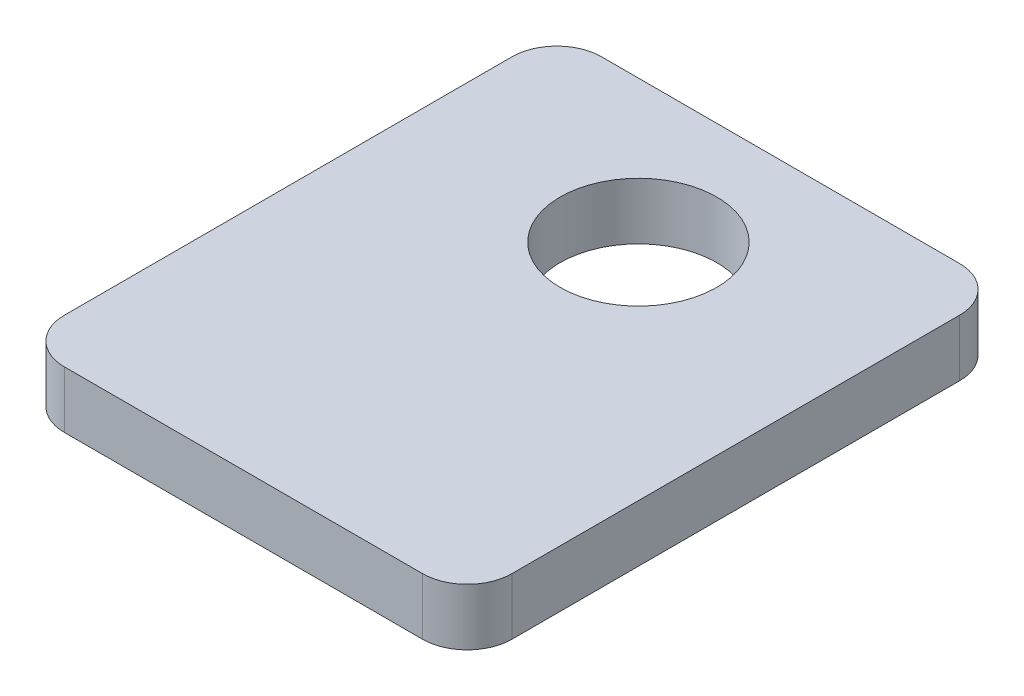
ISO-10303-21;
HEADER;
FILE_DESCRIPTION(('STEP AP214'),'2;1');
FILE_NAME('part.step','',(''),(''),'','','');
FILE_SCHEMA(('AUTOMOTIVE_DESIGN { 1 0 10303 214 1 1 1 1 }'));
ENDSEC;
DATA;
#1=APPLICATION_CONTEXT('core data for automotive mechanical design processes');
#2=APPLICATION_PROTOCOL_DEFINITION('international standard','automotive_design',2000,#1);
#3=PRODUCT_CONTEXT('',#1,'mechanical');
#4=PRODUCT('Part','Part','',(#3));
#5=PRODUCT_RELATED_PRODUCT_CATEGORY('part','',(#4));
#6=PRODUCT_DEFINITION_FORMATION('','',#4);
#7=PRODUCT_DEFINITION_CONTEXT('part definition',#1,'design');
#8=PRODUCT_DEFINITION('design','',#6,#7);
#9=PRODUCT_DEFINITION_SHAPE('','',#8);
#10=(LENGTH_UNIT() NAMED_UNIT(*) SI_UNIT(.MILLI.,.METRE.));
#11=(NAMED_UNIT(*) PLANE_ANGLE_UNIT() SI_UNIT($,.RADIAN.));
#12=(NAMED_UNIT(*) SI_UNIT($,.STERADIAN.) SOLID_ANGLE_UNIT());
#13=UNCERTAINTY_MEASURE_WITH_UNIT(LENGTH_MEASURE(1.E-05),#10,'distance_accuracy_value','');
#14=(GEOMETRIC_REPRESENTATION_CONTEXT(3) GLOBAL_UNCERTAINTY_ASSIGNED_CONTEXT((#13)) GLOBAL_UNIT_ASSIGNED_CONTEXT((#10,
#11,#12)) REPRESENTATION_CONTEXT('',''));
#15=CARTESIAN_POINT('',(0.,0.,0.));
#16=DIRECTION('',(0.,0.,1.));
#17=DIRECTION('',(1.,0.,0.));
#18=AXIS2_PLACEMENT_3D('',#15,#16,#17);
#19=CARTESIAN_POINT('',(0.,1.27,0.));
#20=DIRECTION('',(0.,1.,0.));
#21=DIRECTION('',(0.,0.,1.));
#22=AXIS2_PLACEMENT_3D('',#19,#20,#21);
#23=PLANE('',#22);
#24=DIRECTION('',(-1.,0.,0.));
#25=VECTOR('',#24,1.);
#26=CARTESIAN_POINT('',(0.,1.27,0.));
#27=LINE('',#26,#25);
#28=CARTESIAN_POINT('',(9.,1.27,0.));
#29=VERTEX_POINT('',#28);
#30=CARTESIAN_POINT('',(1.,1.27,0.));
#31=VERTEX_POINT('',#30);
#32=EDGE_CURVE('E154',#29,#31,#27,.T.);
#33=ORIENTED_EDGE('',*,*,#32,.T.);
#34=CARTESIAN_POINT('',(1.,1.27,1.));
#35=DIRECTION('',(0.,1.,0.));
#36=DIRECTION('',(0.,0.,1.));
#37=AXIS2_PLACEMENT_3D('',#34,#35,#36);
#38=CIRCLE('',#37,1.);
#39=CARTESIAN_POINT('',(0.,1.27,1.));
#40=VERTEX_POINT('',#39);
#41=EDGE_CURVE('E203',#31,#40,#38,.T.);
#42=ORIENTED_EDGE('',*,*,#41,.T.);
#43=DIRECTION('',(0.,0.,1.));
#44=VECTOR('',#43,1.);
#45=CARTESIAN_POINT('',(0.,1.27,0.));
#46=LINE('',#45,#44);
#47=CARTESIAN_POINT('',(0.,1.27,11.));
#48=VERTEX_POINT('',#47);
#49=EDGE_CURVE('E134',#40,#48,#46,.T.);
#50=ORIENTED_EDGE('',*,*,#49,.T.);
#51=CARTESIAN_POINT('',(1.,1.27,11.));
#52=DIRECTION('',(0.,1.,0.));
#53=DIRECTION('',(0.,0.,1.));
#54=AXIS2_PLACEMENT_3D('',#51,#52,#53);
#55=CIRCLE('',#54,1.);
#56=CARTESIAN_POINT('',(1.,1.27,12.));
#57=VERTEX_POINT('',#56);
#58=EDGE_CURVE('E199',#48,#57,#55,.T.);
#59=ORIENTED_EDGE('',*,*,#58,.T.);
#60=DIRECTION('',(1.,0.,0.));
#61=VECTOR('',#60,1.);
#62=CARTESIAN_POINT('',(0.,1.27,12.));
#63=LINE('',#62,#61);
#64=CARTESIAN_POINT('',(9.,1.27,12.));
#65=VERTEX_POINT('',#64);
#66=EDGE_CURVE('E190',#57,#65,#63,.T.);
#67=ORIENTED_EDGE('',*,*,#66,.T.);
#68=CARTESIAN_POINT('',(9.,1.27,11.));
#69=DIRECTION('',(0.,1.,0.));
#70=DIRECTION('',(0.,0.,1.));
#71=AXIS2_PLACEMENT_3D('',#68,#69,#70);
#72=CIRCLE('',#71,1.);
#73=CARTESIAN_POINT('',(10.,1.27,11.));
#74=VERTEX_POINT('',#73);
#75=EDGE_CURVE('E68',#65,#74,#72,.T.);
#76=ORIENTED_EDGE('',*,*,#75,.T.);
#77=DIRECTION('',(0.,0.,-1.));
#78=VECTOR('',#77,1.);
#79=CARTESIAN_POINT('',(10.,1.27,0.));
#80=LINE('',#79,#78);
#81=CARTESIAN_POINT('',(10.,1.27,1.));
#82=VERTEX_POINT('',#81);
#83=EDGE_CURVE('E186',#74,#82,#80,.T.);
#84=ORIENTED_EDGE('',*,*,#83,.T.);
#85=CARTESIAN_POINT('',(9.,1.27,1.));
#86=DIRECTION('',(0.,1.,0.));
#87=DIRECTION('',(0.,0.,1.));
#88=AXIS2_PLACEMENT_3D('',#85,#86,#87);
#89=CIRCLE('',#88,1.);
#90=EDGE_CURVE('E177',#82,#29,#89,.T.);
#91=ORIENTED_EDGE('',*,*,#90,.T.);
#92=EDGE_LOOP('',(#33,#42,#50,#59,#67,#76,#84,#91));
#93=FACE_BOUND('',#92,.T.);
#94=CARTESIAN_POINT('',(5.,1.27,3.175));
#95=DIRECTION('',(0.,1.,0.));
#96=DIRECTION('',(0.,0.,1.));
#97=AXIS2_PLACEMENT_3D('',#94,#95,#96);
#98=CIRCLE('',#97,1.75);
#99=CARTESIAN_POINT('',(5.,1.27,4.925));
#100=VERTEX_POINT('',#99);
#101=EDGE_CURVE('E144',#100,#100,#98,.T.);
#102=ORIENTED_EDGE('',*,*,#101,.F.);
#103=EDGE_LOOP('',(#102));
#104=FACE_BOUND('',#103,.T.);
#105=ADVANCED_FACE('F46',(#93,#104),#23,.T.);
#106=CARTESIAN_POINT('',(0.,0.,0.));
#107=DIRECTION('',(0.,1.,0.));
#108=DIRECTION('',(0.,0.,1.));
#109=AXIS2_PLACEMENT_3D('',#106,#107,#108);
#110=PLANE('',#109);
#111=DIRECTION('',(0.,0.,1.));
#112=VECTOR('',#111,1.);
#113=CARTESIAN_POINT('',(0.,0.,0.));
#114=LINE('',#113,#112);
#115=CARTESIAN_POINT('',(0.,0.,1.));
#116=VERTEX_POINT('',#115);
#117=CARTESIAN_POINT('',(0.,0.,11.));
#118=VERTEX_POINT('',#117);
#119=EDGE_CURVE('E131',#116,#118,#114,.T.);
#120=ORIENTED_EDGE('',*,*,#119,.F.);
#121=CARTESIAN_POINT('',(1.,0.,1.));
#122=DIRECTION('',(0.,1.,0.));
#123=DIRECTION('',(0.,0.,1.));
#124=AXIS2_PLACEMENT_3D('',#121,#122,#123);
#125=CIRCLE('',#124,1.);
#126=CARTESIAN_POINT('',(1.,0.,0.));
#127=VERTEX_POINT('',#126);
#128=EDGE_CURVE('E113',#116,#127,#125,.F.);
#129=ORIENTED_EDGE('',*,*,#128,.T.);
#130=DIRECTION('',(-1.,0.,0.));
#131=VECTOR('',#130,1.);
#132=CARTESIAN_POINT('',(0.,0.,0.));
#133=LINE('',#132,#131);
#134=CARTESIAN_POINT('',(9.,0.,0.));
#135=VERTEX_POINT('',#134);
#136=EDGE_CURVE('E160',#135,#127,#133,.T.);
#137=ORIENTED_EDGE('',*,*,#136,.F.);
#138=CARTESIAN_POINT('',(9.,0.,1.));
#139=DIRECTION('',(0.,1.,0.));
#140=DIRECTION('',(0.,0.,1.));
#141=AXIS2_PLACEMENT_3D('',#138,#139,#140);
#142=CIRCLE('',#141,1.);
#143=CARTESIAN_POINT('',(10.,0.,1.));
#144=VERTEX_POINT('',#143);
#145=EDGE_CURVE('E136',#135,#144,#142,.F.);
#146=ORIENTED_EDGE('',*,*,#145,.T.);
#147=DIRECTION('',(0.,0.,-1.));
#148=VECTOR('',#147,1.);
#149=CARTESIAN_POINT('',(10.,0.,0.));
#150=LINE('',#149,#148);
#151=CARTESIAN_POINT('',(10.,0.,11.));
#152=VERTEX_POINT('',#151);
#153=EDGE_CURVE('E149',#152,#144,#150,.T.);
#154=ORIENTED_EDGE('',*,*,#153,.F.);
#155=CARTESIAN_POINT('',(9.,0.,11.));
#156=DIRECTION('',(0.,1.,0.));
#157=DIRECTION('',(0.,0.,1.));
#158=AXIS2_PLACEMENT_3D('',#155,#156,#157);
#159=CIRCLE('',#158,1.);
#160=CARTESIAN_POINT('',(9.,0.,12.));
#161=VERTEX_POINT('',#160);
#162=EDGE_CURVE('E167',#152,#161,#159,.F.);
#163=ORIENTED_EDGE('',*,*,#162,.T.);
#164=DIRECTION('',(1.,0.,0.));
#165=VECTOR('',#164,1.);
#166=CARTESIAN_POINT('',(0.,0.,12.));
#167=LINE('',#166,#165);
#168=CARTESIAN_POINT('',(1.,0.,12.));
#169=VERTEX_POINT('',#168);
#170=EDGE_CURVE('E143',#169,#161,#167,.T.);
#171=ORIENTED_EDGE('',*,*,#170,.F.);
#172=CARTESIAN_POINT('',(1.,0.,11.));
#173=DIRECTION('',(0.,1.,0.));
#174=DIRECTION('',(0.,0.,1.));
#175=AXIS2_PLACEMENT_3D('',#172,#173,#174);
#176=CIRCLE('',#175,1.);
#177=EDGE_CURVE('E125',#169,#118,#176,.F.);
#178=ORIENTED_EDGE('',*,*,#177,.T.);
#179=EDGE_LOOP('',(#120,#129,#137,#146,#154,#163,#171,#178));
#180=FACE_BOUND('',#179,.T.);
#181=CARTESIAN_POINT('',(5.,0.,3.175));
#182=DIRECTION('',(0.,1.,0.));
#183=DIRECTION('',(0.,0.,1.));
#184=AXIS2_PLACEMENT_3D('',#181,#182,#183);
#185=CIRCLE('',#184,1.75);
#186=CARTESIAN_POINT('',(5.,0.,4.925));
#187=VERTEX_POINT('',#186);
#188=EDGE_CURVE('E152',#187,#187,#185,.T.);
#189=ORIENTED_EDGE('',*,*,#188,.T.);
#190=EDGE_LOOP('',(#189));
#191=FACE_BOUND('',#190,.T.);
#192=ADVANCED_FACE('F139',(#180,#191),#110,.F.);
#193=CARTESIAN_POINT('',(0.,1.27,0.));
#194=DIRECTION('',(1.,0.,0.));
#195=DIRECTION('',(0.,0.,-1.));
#196=AXIS2_PLACEMENT_3D('',#193,#194,#195);
#197=PLANE('',#196);
#198=ORIENTED_EDGE('',*,*,#49,.F.);
#199=DIRECTION('',(0.,-1.,0.));
#200=VECTOR('',#199,1.);
#201=CARTESIAN_POINT('',(0.,1.27,1.));
#202=LINE('',#201,#200);
#203=EDGE_CURVE('E117',#40,#116,#202,.T.);
#204=ORIENTED_EDGE('',*,*,#203,.T.);
#205=ORIENTED_EDGE('',*,*,#119,.T.);
#206=DIRECTION('',(0.,-1.,0.));
#207=VECTOR('',#206,1.);
#208=CARTESIAN_POINT('',(0.,1.27,11.));
#209=LINE('',#208,#207);
#210=EDGE_CURVE('E137',#118,#48,#209,.F.);
#211=ORIENTED_EDGE('',*,*,#210,.T.);
#212=EDGE_LOOP('',(#198,#204,#205,#211));
#213=FACE_BOUND('',#212,.T.);
#214=ADVANCED_FACE('F130',(#213),#197,.F.);
#215=CARTESIAN_POINT('',(0.,1.27,12.));
#216=DIRECTION('',(0.,0.,-1.));
#217=DIRECTION('',(-1.,0.,0.));
#218=AXIS2_PLACEMENT_3D('',#215,#216,#217);
#219=PLANE('',#218);
#220=ORIENTED_EDGE('',*,*,#66,.F.);
#221=DIRECTION('',(0.,-1.,0.));
#222=VECTOR('',#221,1.);
#223=CARTESIAN_POINT('',(1.,1.27,12.));
#224=LINE('',#223,#222);
#225=EDGE_CURVE('E211',#57,#169,#224,.T.);
#226=ORIENTED_EDGE('',*,*,#225,.T.);
#227=ORIENTED_EDGE('',*,*,#170,.T.);
#228=DIRECTION('',(0.,-1.,0.));
#229=VECTOR('',#228,1.);
#230=CARTESIAN_POINT('',(9.,1.27,12.));
#231=LINE('',#230,#229);
#232=EDGE_CURVE('E207',#161,#65,#231,.F.);
#233=ORIENTED_EDGE('',*,*,#232,.T.);
#234=EDGE_LOOP('',(#220,#226,#227,#233));
#235=FACE_BOUND('',#234,.T.);
#236=ADVANCED_FACE('F226',(#235),#219,.F.);
#237=CARTESIAN_POINT('',(10.,1.27,0.));
#238=DIRECTION('',(-1.,0.,0.));
#239=DIRECTION('',(0.,0.,1.));
#240=AXIS2_PLACEMENT_3D('',#237,#238,#239);
#241=PLANE('',#240);
#242=ORIENTED_EDGE('',*,*,#83,.F.);
#243=DIRECTION('',(0.,-1.,0.));
#244=VECTOR('',#243,1.);
#245=CARTESIAN_POINT('',(10.,1.27,11.));
#246=LINE('',#245,#244);
#247=EDGE_CURVE('E12',#74,#152,#246,.T.);
#248=ORIENTED_EDGE('',*,*,#247,.T.);
#249=ORIENTED_EDGE('',*,*,#153,.T.);
#250=DIRECTION('',(0.,-1.,0.));
#251=VECTOR('',#250,1.);
#252=CARTESIAN_POINT('',(10.,1.27,1.));
#253=LINE('',#252,#251);
#254=EDGE_CURVE('E55',#144,#82,#253,.F.);
#255=ORIENTED_EDGE('',*,*,#254,.T.);
#256=EDGE_LOOP('',(#242,#248,#249,#255));
#257=FACE_BOUND('',#256,.T.);
#258=ADVANCED_FACE('F232',(#257),#241,.F.);
#259=CARTESIAN_POINT('',(0.,1.27,0.));
#260=DIRECTION('',(0.,0.,1.));
#261=DIRECTION('',(1.,0.,0.));
#262=AXIS2_PLACEMENT_3D('',#259,#260,#261);
#263=PLANE('',#262);
#264=ORIENTED_EDGE('',*,*,#136,.T.);
#265=DIRECTION('',(0.,-1.,0.));
#266=VECTOR('',#265,1.);
#267=CARTESIAN_POINT('',(1.,1.27,0.));
#268=LINE('',#267,#266);
#269=EDGE_CURVE('E118',#127,#31,#268,.F.);
#270=ORIENTED_EDGE('',*,*,#269,.T.);
#271=ORIENTED_EDGE('',*,*,#32,.F.);
#272=DIRECTION('',(0.,-1.,0.));
#273=VECTOR('',#272,1.);
#274=CARTESIAN_POINT('',(9.,1.27,0.));
#275=LINE('',#274,#273);
#276=EDGE_CURVE('E124',#29,#135,#275,.T.);
#277=ORIENTED_EDGE('',*,*,#276,.T.);
#278=EDGE_LOOP('',(#264,#270,#271,#277));
#279=FACE_BOUND('',#278,.T.);
#280=ADVANCED_FACE('F238',(#279),#263,.F.);
#281=CARTESIAN_POINT('',(5.,1.27,3.175));
#282=DIRECTION('',(0.,-1.,0.));
#283=DIRECTION('',(0.,0.,-1.));
#284=AXIS2_PLACEMENT_3D('',#281,#282,#283);
#285=CYLINDRICAL_SURFACE('',#284,1.75);
#286=ORIENTED_EDGE('',*,*,#101,.T.);
#287=EDGE_LOOP('',(#286));
#288=FACE_BOUND('',#287,.T.);
#289=ORIENTED_EDGE('',*,*,#188,.F.);
#290=EDGE_LOOP('',(#289));
#291=FACE_BOUND('',#290,.T.);
#292=ADVANCED_FACE('F240',(#288,#291),#285,.F.);
#293=CARTESIAN_POINT('',(1.,1.27,1.));
#294=DIRECTION('',(0.,-1.,0.));
#295=DIRECTION('',(0.,0.,-1.));
#296=AXIS2_PLACEMENT_3D('',#293,#294,#295);
#297=CYLINDRICAL_SURFACE('',#296,1.);
#298=ORIENTED_EDGE('',*,*,#41,.F.);
#299=ORIENTED_EDGE('',*,*,#269,.F.);
#300=ORIENTED_EDGE('',*,*,#128,.F.);
#301=ORIENTED_EDGE('',*,*,#203,.F.);
#302=EDGE_LOOP('',(#298,#299,#300,#301));
#303=FACE_BOUND('',#302,.T.);
#304=ADVANCED_FACE('F116',(#303),#297,.T.);
#305=CARTESIAN_POINT('',(1.,1.27,11.));
#306=DIRECTION('',(0.,-1.,0.));
#307=DIRECTION('',(0.,0.,-1.));
#308=AXIS2_PLACEMENT_3D('',#305,#306,#307);
#309=CYLINDRICAL_SURFACE('',#308,1.);
#310=ORIENTED_EDGE('',*,*,#58,.F.);
#311=ORIENTED_EDGE('',*,*,#210,.F.);
#312=ORIENTED_EDGE('',*,*,#177,.F.);
#313=ORIENTED_EDGE('',*,*,#225,.F.);
#314=EDGE_LOOP('',(#310,#311,#312,#313));
#315=FACE_BOUND('',#314,.T.);
#316=ADVANCED_FACE('F224',(#315),#309,.T.);
#317=CARTESIAN_POINT('',(9.,1.27,11.));
#318=DIRECTION('',(0.,-1.,0.));
#319=DIRECTION('',(0.,0.,-1.));
#320=AXIS2_PLACEMENT_3D('',#317,#318,#319);
#321=CYLINDRICAL_SURFACE('',#320,1.);
#322=ORIENTED_EDGE('',*,*,#75,.F.);
#323=ORIENTED_EDGE('',*,*,#232,.F.);
#324=ORIENTED_EDGE('',*,*,#162,.F.);
#325=ORIENTED_EDGE('',*,*,#247,.F.);
#326=EDGE_LOOP('',(#322,#323,#324,#325));
#327=FACE_BOUND('',#326,.T.);
#328=ADVANCED_FACE('F231',(#327),#321,.T.);
#329=CARTESIAN_POINT('',(9.,1.27,1.));
#330=DIRECTION('',(0.,-1.,0.));
#331=DIRECTION('',(0.,0.,-1.));
#332=AXIS2_PLACEMENT_3D('',#329,#330,#331);
#333=CYLINDRICAL_SURFACE('',#332,1.);
#334=ORIENTED_EDGE('',*,*,#90,.F.);
#335=ORIENTED_EDGE('',*,*,#254,.F.);
#336=ORIENTED_EDGE('',*,*,#145,.F.);
#337=ORIENTED_EDGE('',*,*,#276,.F.);
#338=EDGE_LOOP('',(#334,#335,#336,#337));
#339=FACE_BOUND('',#338,.T.);
#340=ADVANCED_FACE('F48',(#339),#333,.T.);
#341=CLOSED_SHELL('',(#105,#192,#214,#236,#258,#280,#292,#304,#316,#328,#340));
#342=MANIFOLD_SOLID_BREP('B2',#341);
#343=ADVANCED_BREP_SHAPE_REPRESENTATION('',(#18,#342),#14);
#344=SHAPE_DEFINITION_REPRESENTATION(#9,#343);
ENDSEC;
END-ISO-10303-21;
